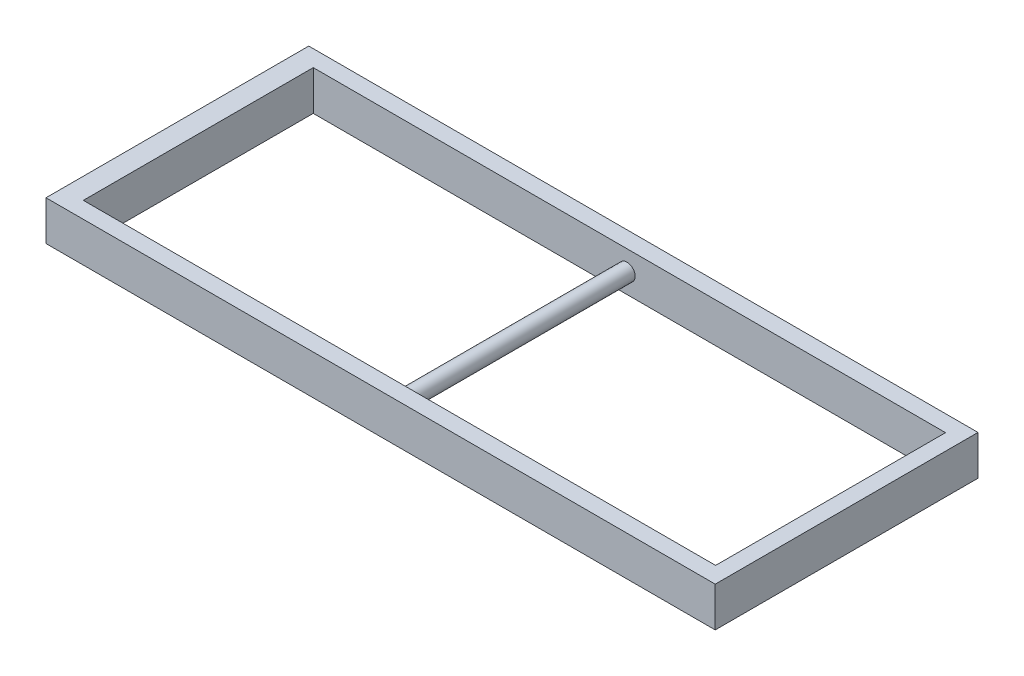
ISO-10303-21;
HEADER;
FILE_DESCRIPTION(('STEP AP214'),'2;1');
FILE_NAME('part.step','',(''),(''),'','','');
FILE_SCHEMA(('AUTOMOTIVE_DESIGN { 1 0 10303 214 1 1 1 1 }'));
ENDSEC;
DATA;
#1=APPLICATION_CONTEXT('core data for automotive mechanical design processes');
#2=APPLICATION_PROTOCOL_DEFINITION('international standard','automotive_design',2000,#1);
#3=PRODUCT_CONTEXT('',#1,'mechanical');
#4=PRODUCT('Part','Part','',(#3));
#5=PRODUCT_RELATED_PRODUCT_CATEGORY('part','',(#4));
#6=PRODUCT_DEFINITION_FORMATION('','',#4);
#7=PRODUCT_DEFINITION_CONTEXT('part definition',#1,'design');
#8=PRODUCT_DEFINITION('design','',#6,#7);
#9=PRODUCT_DEFINITION_SHAPE('','',#8);
#10=(LENGTH_UNIT() NAMED_UNIT(*) SI_UNIT(.MILLI.,.METRE.));
#11=(NAMED_UNIT(*) PLANE_ANGLE_UNIT() SI_UNIT($,.RADIAN.));
#12=(NAMED_UNIT(*) SI_UNIT($,.STERADIAN.) SOLID_ANGLE_UNIT());
#13=UNCERTAINTY_MEASURE_WITH_UNIT(LENGTH_MEASURE(1.E-05),#10,'distance_accuracy_value','');
#14=(GEOMETRIC_REPRESENTATION_CONTEXT(3) GLOBAL_UNCERTAINTY_ASSIGNED_CONTEXT((#13)) GLOBAL_UNIT_ASSIGNED_CONTEXT((#10,
#11,#12)) REPRESENTATION_CONTEXT('',''));
#15=CARTESIAN_POINT('',(0.,0.,0.));
#16=DIRECTION('',(0.,0.,1.));
#17=DIRECTION('',(1.,0.,0.));
#18=AXIS2_PLACEMENT_3D('',#15,#16,#17);
#19=CARTESIAN_POINT('',(-104.129137296077,7.66957039966685,-50.8));
#20=DIRECTION('',(0.,0.,-1.));
#21=DIRECTION('',(-1.,0.,0.));
#22=AXIS2_PLACEMENT_3D('',#19,#20,#21);
#23=PLANE('',#22);
#24=DIRECTION('',(0.,1.,0.));
#25=VECTOR('',#24,1.);
#26=CARTESIAN_POINT('',(25.2521127039233,0.,-50.8));
#27=LINE('',#26,#25);
#28=CARTESIAN_POINT('',(25.2521127039233,0.,-50.8));
#29=VERTEX_POINT('',#28);
#30=CARTESIAN_POINT('',(25.2521127039233,15.3391407993337,-50.8));
#31=VERTEX_POINT('',#30);
#32=EDGE_CURVE('E79',#29,#31,#27,.T.);
#33=ORIENTED_EDGE('',*,*,#32,.F.);
#34=DIRECTION('',(1.,0.,0.));
#35=VECTOR('',#34,1.);
#36=CARTESIAN_POINT('',(-233.510387296077,0.,-50.8));
#37=LINE('',#36,#35);
#38=CARTESIAN_POINT('',(-233.510387296077,0.,-50.8));
#39=VERTEX_POINT('',#38);
#40=EDGE_CURVE('E76',#39,#29,#37,.T.);
#41=ORIENTED_EDGE('',*,*,#40,.F.);
#42=DIRECTION('',(0.,1.,0.));
#43=VECTOR('',#42,1.);
#44=CARTESIAN_POINT('',(-233.510387296077,15.3391407993337,-50.8));
#45=LINE('',#44,#43);
#46=CARTESIAN_POINT('',(-233.510387296077,15.3391407993337,-50.8));
#47=VERTEX_POINT('',#46);
#48=EDGE_CURVE('E106',#47,#39,#45,.F.);
#49=ORIENTED_EDGE('',*,*,#48,.F.);
#50=DIRECTION('',(1.,0.,0.));
#51=VECTOR('',#50,1.);
#52=CARTESIAN_POINT('',(25.2521127039233,15.3391407993337,-50.8));
#53=LINE('',#52,#51);
#54=EDGE_CURVE('E82',#31,#47,#53,.F.);
#55=ORIENTED_EDGE('',*,*,#54,.F.);
#56=EDGE_LOOP('',(#33,#41,#49,#55));
#57=FACE_BOUND('',#56,.T.);
#58=ADVANCED_FACE('F16',(#57),#23,.T.);
#59=CARTESIAN_POINT('',(-233.510387296077,15.3391407993337,0.));
#60=DIRECTION('',(-1.,0.,0.));
#61=DIRECTION('',(0.,0.,1.));
#62=AXIS2_PLACEMENT_3D('',#59,#60,#61);
#63=PLANE('',#62);
#64=DIRECTION('',(0.,1.,0.));
#65=VECTOR('',#64,1.);
#66=CARTESIAN_POINT('',(-233.510387296077,7.66957039966685,50.8));
#67=LINE('',#66,#65);
#68=CARTESIAN_POINT('',(-233.510387296077,15.3391407993337,50.8));
#69=VERTEX_POINT('',#68);
#70=CARTESIAN_POINT('',(-233.510387296077,0.,50.8));
#71=VERTEX_POINT('',#70);
#72=EDGE_CURVE('E87',#69,#71,#67,.F.);
#73=ORIENTED_EDGE('',*,*,#72,.F.);
#74=DIRECTION('',(0.,0.,1.));
#75=VECTOR('',#74,1.);
#76=CARTESIAN_POINT('',(-233.510387296077,15.3391407993337,0.));
#77=LINE('',#76,#75);
#78=EDGE_CURVE('E111',#47,#69,#77,.T.);
#79=ORIENTED_EDGE('',*,*,#78,.F.);
#80=ORIENTED_EDGE('',*,*,#48,.T.);
#81=DIRECTION('',(0.,0.,-1.));
#82=VECTOR('',#81,1.);
#83=CARTESIAN_POINT('',(-233.510387296077,0.,0.));
#84=LINE('',#83,#82);
#85=EDGE_CURVE('E100',#71,#39,#84,.T.);
#86=ORIENTED_EDGE('',*,*,#85,.F.);
#87=EDGE_LOOP('',(#73,#79,#80,#86));
#88=FACE_BOUND('',#87,.T.);
#89=ADVANCED_FACE('F109',(#88),#63,.T.);
#90=CARTESIAN_POINT('',(-104.129137296077,7.66957039966685,50.8));
#91=DIRECTION('',(0.,0.,1.));
#92=DIRECTION('',(1.,0.,0.));
#93=AXIS2_PLACEMENT_3D('',#90,#91,#92);
#94=PLANE('',#93);
#95=ORIENTED_EDGE('',*,*,#72,.T.);
#96=DIRECTION('',(1.,0.,0.));
#97=VECTOR('',#96,1.);
#98=CARTESIAN_POINT('',(-233.510387296077,0.,50.8));
#99=LINE('',#98,#97);
#100=CARTESIAN_POINT('',(25.2521127039233,0.,50.8));
#101=VERTEX_POINT('',#100);
#102=EDGE_CURVE('E95',#101,#71,#99,.F.);
#103=ORIENTED_EDGE('',*,*,#102,.F.);
#104=DIRECTION('',(0.,1.,0.));
#105=VECTOR('',#104,1.);
#106=CARTESIAN_POINT('',(25.2521127039233,0.,50.8));
#107=LINE('',#106,#105);
#108=CARTESIAN_POINT('',(25.2521127039233,15.3391407993337,50.8));
#109=VERTEX_POINT('',#108);
#110=EDGE_CURVE('E86',#109,#101,#107,.F.);
#111=ORIENTED_EDGE('',*,*,#110,.F.);
#112=DIRECTION('',(1.,0.,0.));
#113=VECTOR('',#112,1.);
#114=CARTESIAN_POINT('',(25.2521127039233,15.3391407993337,50.8));
#115=LINE('',#114,#113);
#116=EDGE_CURVE('E115',#69,#109,#115,.T.);
#117=ORIENTED_EDGE('',*,*,#116,.F.);
#118=EDGE_LOOP('',(#95,#103,#111,#117));
#119=FACE_BOUND('',#118,.T.);
#120=ADVANCED_FACE('F127',(#119),#94,.T.);
#121=CARTESIAN_POINT('',(25.2521127039233,0.,0.));
#122=DIRECTION('',(1.,0.,0.));
#123=DIRECTION('',(0.,0.,-1.));
#124=AXIS2_PLACEMENT_3D('',#121,#122,#123);
#125=PLANE('',#124);
#126=ORIENTED_EDGE('',*,*,#110,.T.);
#127=DIRECTION('',(0.,0.,-1.));
#128=VECTOR('',#127,1.);
#129=CARTESIAN_POINT('',(25.2521127039233,0.,0.));
#130=LINE('',#129,#128);
#131=EDGE_CURVE('E90',#29,#101,#130,.F.);
#132=ORIENTED_EDGE('',*,*,#131,.F.);
#133=ORIENTED_EDGE('',*,*,#32,.T.);
#134=DIRECTION('',(0.,0.,1.));
#135=VECTOR('',#134,1.);
#136=CARTESIAN_POINT('',(25.2521127039233,15.3391407993337,0.));
#137=LINE('',#136,#135);
#138=EDGE_CURVE('E118',#109,#31,#137,.F.);
#139=ORIENTED_EDGE('',*,*,#138,.F.);
#140=EDGE_LOOP('',(#126,#132,#133,#139));
#141=FACE_BOUND('',#140,.T.);
#142=ADVANCED_FACE('F91',(#141),#125,.T.);
#143=CARTESIAN_POINT('',(19.05,0.,0.));
#144=DIRECTION('',(-1.,0.,0.));
#145=DIRECTION('',(0.,0.,1.));
#146=AXIS2_PLACEMENT_3D('',#143,#144,#145);
#147=PLANE('',#146);
#148=DIRECTION('',(0.,1.,0.));
#149=VECTOR('',#148,1.);
#150=CARTESIAN_POINT('',(19.05,7.66957039966683,44.45));
#151=LINE('',#150,#149);
#152=CARTESIAN_POINT('',(19.05,15.3391407993337,44.45));
#153=VERTEX_POINT('',#152);
#154=CARTESIAN_POINT('',(19.05,0.,44.45));
#155=VERTEX_POINT('',#154);
#156=EDGE_CURVE('E146',#153,#155,#151,.F.);
#157=ORIENTED_EDGE('',*,*,#156,.F.);
#158=DIRECTION('',(0.,0.,1.));
#159=VECTOR('',#158,1.);
#160=CARTESIAN_POINT('',(19.05,15.3391407993337,0.));
#161=LINE('',#160,#159);
#162=CARTESIAN_POINT('',(19.05,15.3391407993337,-44.45));
#163=VERTEX_POINT('',#162);
#164=EDGE_CURVE('E131',#163,#153,#161,.T.);
#165=ORIENTED_EDGE('',*,*,#164,.F.);
#166=DIRECTION('',(0.,1.,0.));
#167=VECTOR('',#166,1.);
#168=CARTESIAN_POINT('',(19.05,7.66957039966683,-44.45));
#169=LINE('',#168,#167);
#170=CARTESIAN_POINT('',(19.05,0.,-44.45));
#171=VERTEX_POINT('',#170);
#172=EDGE_CURVE('E140',#171,#163,#169,.T.);
#173=ORIENTED_EDGE('',*,*,#172,.F.);
#174=DIRECTION('',(0.,0.,-1.));
#175=VECTOR('',#174,1.);
#176=CARTESIAN_POINT('',(19.05,0.,0.));
#177=LINE('',#176,#175);
#178=EDGE_CURVE('E121',#155,#171,#177,.T.);
#179=ORIENTED_EDGE('',*,*,#178,.F.);
#180=EDGE_LOOP('',(#157,#165,#173,#179));
#181=FACE_BOUND('',#180,.T.);
#182=ADVANCED_FACE('F173',(#181),#147,.T.);
#183=CARTESIAN_POINT('',(-233.510387296077,0.,0.));
#184=DIRECTION('',(0.,-1.,0.));
#185=DIRECTION('',(0.,0.,-1.));
#186=AXIS2_PLACEMENT_3D('',#183,#184,#185);
#187=PLANE('',#186);
#188=DIRECTION('',(1.,0.,0.));
#189=VECTOR('',#188,1.);
#190=CARTESIAN_POINT('',(-103.1875,0.,-44.45));
#191=LINE('',#190,#189);
#192=CARTESIAN_POINT('',(-225.425,0.,-44.45));
#193=VERTEX_POINT('',#192);
#194=EDGE_CURVE('E137',#193,#171,#191,.T.);
#195=ORIENTED_EDGE('',*,*,#194,.F.);
#196=DIRECTION('',(0.,0.,-1.));
#197=VECTOR('',#196,1.);
#198=CARTESIAN_POINT('',(-225.425,0.,0.));
#199=LINE('',#198,#197);
#200=CARTESIAN_POINT('',(-225.425,0.,44.45));
#201=VERTEX_POINT('',#200);
#202=EDGE_CURVE('E119',#201,#193,#199,.T.);
#203=ORIENTED_EDGE('',*,*,#202,.F.);
#204=DIRECTION('',(-1.,0.,0.));
#205=VECTOR('',#204,1.);
#206=CARTESIAN_POINT('',(-103.1875,0.,44.45));
#207=LINE('',#206,#205);
#208=EDGE_CURVE('E149',#155,#201,#207,.T.);
#209=ORIENTED_EDGE('',*,*,#208,.F.);
#210=ORIENTED_EDGE('',*,*,#178,.T.);
#211=EDGE_LOOP('',(#195,#203,#209,#210));
#212=FACE_BOUND('',#211,.T.);
#213=ORIENTED_EDGE('',*,*,#102,.T.);
#214=ORIENTED_EDGE('',*,*,#85,.T.);
#215=ORIENTED_EDGE('',*,*,#40,.T.);
#216=ORIENTED_EDGE('',*,*,#131,.T.);
#217=EDGE_LOOP('',(#213,#214,#215,#216));
#218=FACE_BOUND('',#217,.T.);
#219=ADVANCED_FACE('F98',(#212,#218),#187,.T.);
#220=CARTESIAN_POINT('',(-225.425,15.3391407993337,0.));
#221=DIRECTION('',(1.,0.,0.));
#222=DIRECTION('',(0.,0.,-1.));
#223=AXIS2_PLACEMENT_3D('',#220,#221,#222);
#224=PLANE('',#223);
#225=DIRECTION('',(0.,1.,0.));
#226=VECTOR('',#225,1.);
#227=CARTESIAN_POINT('',(-225.425,7.66957039966683,44.45));
#228=LINE('',#227,#226);
#229=CARTESIAN_POINT('',(-225.425,15.3391407993337,44.45));
#230=VERTEX_POINT('',#229);
#231=EDGE_CURVE('E152',#201,#230,#228,.T.);
#232=ORIENTED_EDGE('',*,*,#231,.F.);
#233=ORIENTED_EDGE('',*,*,#202,.T.);
#234=DIRECTION('',(0.,1.,0.));
#235=VECTOR('',#234,1.);
#236=CARTESIAN_POINT('',(-225.425,7.66957039966683,-44.45));
#237=LINE('',#236,#235);
#238=CARTESIAN_POINT('',(-225.425,15.3391407993337,-44.45));
#239=VERTEX_POINT('',#238);
#240=EDGE_CURVE('E134',#239,#193,#237,.F.);
#241=ORIENTED_EDGE('',*,*,#240,.F.);
#242=DIRECTION('',(0.,0.,1.));
#243=VECTOR('',#242,1.);
#244=CARTESIAN_POINT('',(-225.425,15.3391407993337,0.));
#245=LINE('',#244,#243);
#246=EDGE_CURVE('E32',#230,#239,#245,.F.);
#247=ORIENTED_EDGE('',*,*,#246,.F.);
#248=EDGE_LOOP('',(#232,#233,#241,#247));
#249=FACE_BOUND('',#248,.T.);
#250=ADVANCED_FACE('F176',(#249),#224,.T.);
#251=CARTESIAN_POINT('',(25.2521127039233,15.3391407993337,0.));
#252=DIRECTION('',(0.,1.,0.));
#253=DIRECTION('',(0.,0.,1.));
#254=AXIS2_PLACEMENT_3D('',#251,#252,#253);
#255=PLANE('',#254);
#256=DIRECTION('',(1.,0.,0.));
#257=VECTOR('',#256,1.);
#258=CARTESIAN_POINT('',(-103.1875,15.3391407993337,-44.45));
#259=LINE('',#258,#257);
#260=EDGE_CURVE('E143',#163,#239,#259,.F.);
#261=ORIENTED_EDGE('',*,*,#260,.F.);
#262=ORIENTED_EDGE('',*,*,#164,.T.);
#263=DIRECTION('',(-1.,0.,0.));
#264=VECTOR('',#263,1.);
#265=CARTESIAN_POINT('',(-103.1875,15.3391407993337,44.45));
#266=LINE('',#265,#264);
#267=EDGE_CURVE('E155',#230,#153,#266,.F.);
#268=ORIENTED_EDGE('',*,*,#267,.F.);
#269=ORIENTED_EDGE('',*,*,#246,.T.);
#270=EDGE_LOOP('',(#261,#262,#268,#269));
#271=FACE_BOUND('',#270,.T.);
#272=ORIENTED_EDGE('',*,*,#116,.T.);
#273=ORIENTED_EDGE('',*,*,#138,.T.);
#274=ORIENTED_EDGE('',*,*,#54,.T.);
#275=ORIENTED_EDGE('',*,*,#78,.T.);
#276=EDGE_LOOP('',(#272,#273,#274,#275));
#277=FACE_BOUND('',#276,.T.);
#278=ADVANCED_FACE('F117',(#271,#277),#255,.T.);
#279=CARTESIAN_POINT('',(-103.1875,7.66957039966683,-44.45));
#280=DIRECTION('',(0.,0.,1.));
#281=DIRECTION('',(1.,0.,0.));
#282=AXIS2_PLACEMENT_3D('',#279,#280,#281);
#283=PLANE('',#282);
#284=CARTESIAN_POINT('',(-104.129137296077,7.66957039966683,-44.45));
#285=DIRECTION('',(0.,0.,-1.));
#286=DIRECTION('',(-1.,0.,0.));
#287=AXIS2_PLACEMENT_3D('',#284,#285,#286);
#288=CIRCLE('',#287,3.175);
#289=CARTESIAN_POINT('',(-107.304137296077,7.66957039966683,-44.45));
#290=VERTEX_POINT('',#289);
#291=EDGE_CURVE('E19',#290,#290,#288,.F.);
#292=ORIENTED_EDGE('',*,*,#291,.F.);
#293=EDGE_LOOP('',(#292));
#294=FACE_BOUND('',#293,.T.);
#295=ORIENTED_EDGE('',*,*,#172,.T.);
#296=ORIENTED_EDGE('',*,*,#260,.T.);
#297=ORIENTED_EDGE('',*,*,#240,.T.);
#298=ORIENTED_EDGE('',*,*,#194,.T.);
#299=EDGE_LOOP('',(#295,#296,#297,#298));
#300=FACE_BOUND('',#299,.T.);
#301=ADVANCED_FACE('F164',(#294,#300),#283,.T.);
#302=CARTESIAN_POINT('',(-103.1875,7.66957039966683,44.45));
#303=DIRECTION('',(0.,0.,-1.));
#304=DIRECTION('',(-1.,0.,0.));
#305=AXIS2_PLACEMENT_3D('',#302,#303,#304);
#306=PLANE('',#305);
#307=CARTESIAN_POINT('',(-104.129137296077,7.66957039966683,44.45));
#308=DIRECTION('',(0.,0.,-1.));
#309=DIRECTION('',(-1.,0.,0.));
#310=AXIS2_PLACEMENT_3D('',#307,#308,#309);
#311=CIRCLE('',#310,3.175);
#312=CARTESIAN_POINT('',(-107.304137296077,7.66957039966683,44.45));
#313=VERTEX_POINT('',#312);
#314=EDGE_CURVE('E10',#313,#313,#311,.T.);
#315=ORIENTED_EDGE('',*,*,#314,.F.);
#316=EDGE_LOOP('',(#315));
#317=FACE_BOUND('',#316,.T.);
#318=ORIENTED_EDGE('',*,*,#231,.T.);
#319=ORIENTED_EDGE('',*,*,#267,.T.);
#320=ORIENTED_EDGE('',*,*,#156,.T.);
#321=ORIENTED_EDGE('',*,*,#208,.T.);
#322=EDGE_LOOP('',(#318,#319,#320,#321));
#323=FACE_BOUND('',#322,.T.);
#324=ADVANCED_FACE('F167',(#317,#323),#306,.T.);
#325=CARTESIAN_POINT('',(-104.129137296077,7.66957039966683,44.45));
#326=DIRECTION('',(0.,0.,-1.));
#327=DIRECTION('',(-1.,0.,0.));
#328=AXIS2_PLACEMENT_3D('',#325,#326,#327);
#329=CYLINDRICAL_SURFACE('',#328,3.175);
#330=ORIENTED_EDGE('',*,*,#291,.T.);
#331=EDGE_LOOP('',(#330));
#332=FACE_BOUND('',#331,.T.);
#333=ORIENTED_EDGE('',*,*,#314,.T.);
#334=EDGE_LOOP('',(#333));
#335=FACE_BOUND('',#334,.T.);
#336=ADVANCED_FACE('F161',(#332,#335),#329,.T.);
#337=CLOSED_SHELL('',(#58,#89,#120,#142,#182,#219,#250,#278,#301,#324,#336));
#338=MANIFOLD_SOLID_BREP('B1',#337);
#339=ADVANCED_BREP_SHAPE_REPRESENTATION('',(#18,#338),#14);
#340=SHAPE_DEFINITION_REPRESENTATION(#9,#339);
ENDSEC;
END-ISO-10303-21;
